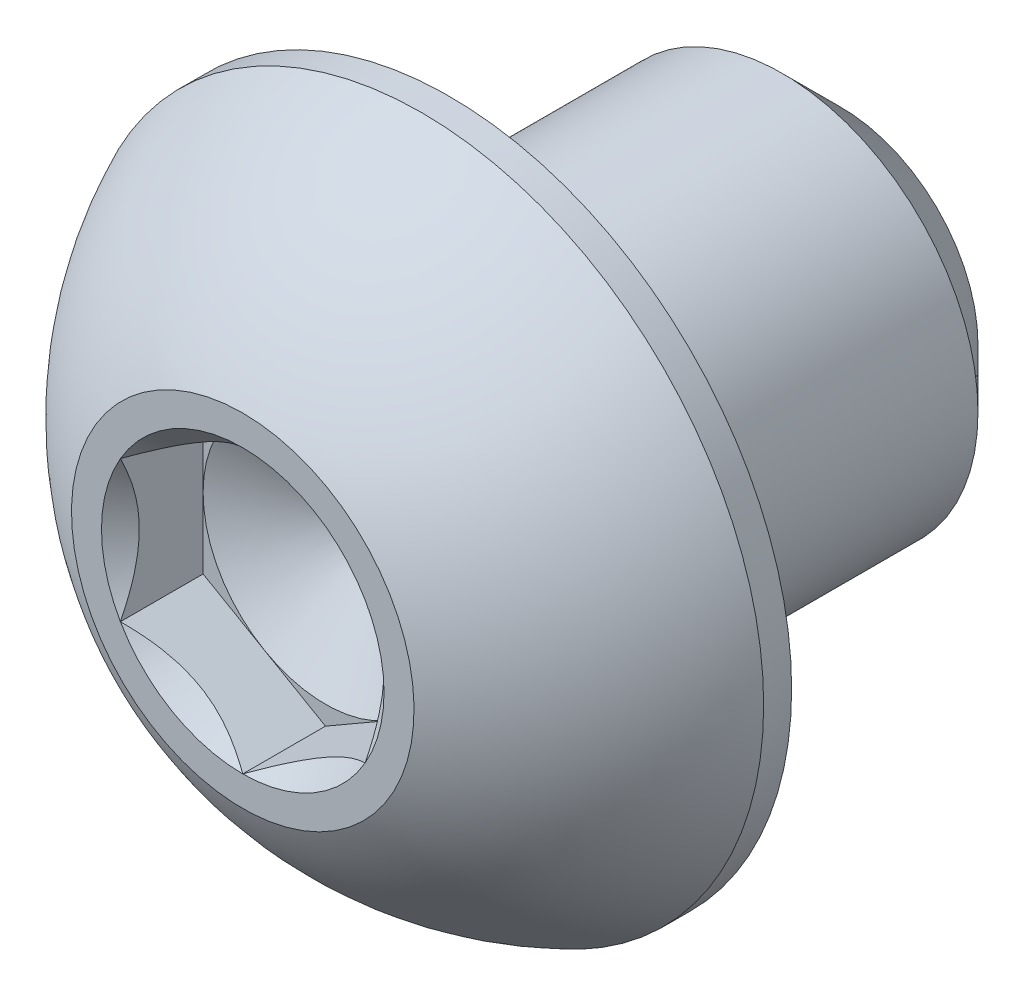
ISO-10303-21;
HEADER;
FILE_DESCRIPTION(('STEP AP214'),'2;1');
FILE_NAME('part.step','',(''),(''),'','','');
FILE_SCHEMA(('AUTOMOTIVE_DESIGN { 1 0 10303 214 1 1 1 1 }'));
ENDSEC;
DATA;
#1=APPLICATION_CONTEXT('core data for automotive mechanical design processes');
#2=APPLICATION_PROTOCOL_DEFINITION('international standard','automotive_design',2000,#1);
#3=PRODUCT_CONTEXT('',#1,'mechanical');
#4=PRODUCT('Part','Part','',(#3));
#5=PRODUCT_RELATED_PRODUCT_CATEGORY('part','',(#4));
#6=PRODUCT_DEFINITION_FORMATION('','',#4);
#7=PRODUCT_DEFINITION_CONTEXT('part definition',#1,'design');
#8=PRODUCT_DEFINITION('design','',#6,#7);
#9=PRODUCT_DEFINITION_SHAPE('','',#8);
#10=(LENGTH_UNIT() NAMED_UNIT(*) SI_UNIT(.MILLI.,.METRE.));
#11=(NAMED_UNIT(*) PLANE_ANGLE_UNIT() SI_UNIT($,.RADIAN.));
#12=(NAMED_UNIT(*) SI_UNIT($,.STERADIAN.) SOLID_ANGLE_UNIT());
#13=UNCERTAINTY_MEASURE_WITH_UNIT(LENGTH_MEASURE(1.E-05),#10,'distance_accuracy_value','');
#14=(GEOMETRIC_REPRESENTATION_CONTEXT(3) GLOBAL_UNCERTAINTY_ASSIGNED_CONTEXT((#13)) GLOBAL_UNIT_ASSIGNED_CONTEXT((#10,
#11,#12)) REPRESENTATION_CONTEXT('',''));
#15=CARTESIAN_POINT('',(0.,0.,0.));
#16=DIRECTION('',(0.,0.,1.));
#17=DIRECTION('',(1.,0.,0.));
#18=AXIS2_PLACEMENT_3D('',#15,#16,#17);
#19=CARTESIAN_POINT('',(0.,1.984375,4.8514));
#20=DIRECTION('',(0.,0.,-1.));
#21=DIRECTION('',(-1.,0.,0.));
#22=AXIS2_PLACEMENT_3D('',#19,#20,#21);
#23=PLANE('',#22);
#24=CARTESIAN_POINT('',(0.,0.,4.8514));
#25=DIRECTION('',(0.,0.,1.));
#26=DIRECTION('',(1.,0.,0.));
#27=AXIS2_PLACEMENT_3D('',#24,#25,#26);
#28=CIRCLE('',#27,2.778125);
#29=CARTESIAN_POINT('',(0.,2.778125,4.8514));
#30=VERTEX_POINT('',#29);
#31=EDGE_CURVE('E187',#30,#30,#28,.T.);
#32=ORIENTED_EDGE('',*,*,#31,.T.);
#33=EDGE_LOOP('',(#32));
#34=FACE_BOUND('',#33,.T.);
#35=CARTESIAN_POINT('',(0.,0.,4.8514));
#36=DIRECTION('',(0.,0.,1.));
#37=DIRECTION('',(1.,0.,0.));
#38=AXIS2_PLACEMENT_3D('',#35,#36,#37);
#39=CIRCLE('',#38,2.29135888084633);
#40=CARTESIAN_POINT('',(0.,2.29135888084633,4.8514));
#41=VERTEX_POINT('',#40);
#42=CARTESIAN_POINT('',(-1.984375,1.14567944042316,4.8514));
#43=VERTEX_POINT('',#42);
#44=EDGE_CURVE('E129',#41,#43,#39,.T.);
#45=ORIENTED_EDGE('',*,*,#44,.F.);
#46=CARTESIAN_POINT('',(0.,0.,4.8514));
#47=DIRECTION('',(0.,0.,1.));
#48=DIRECTION('',(1.,0.,0.));
#49=AXIS2_PLACEMENT_3D('',#46,#47,#48);
#50=CIRCLE('',#49,2.29135888084633);
#51=CARTESIAN_POINT('',(1.984375,1.14567944042316,4.8514));
#52=VERTEX_POINT('',#51);
#53=EDGE_CURVE('E113',#52,#41,#50,.T.);
#54=ORIENTED_EDGE('',*,*,#53,.F.);
#55=CARTESIAN_POINT('',(0.,0.,4.8514));
#56=DIRECTION('',(0.,0.,1.));
#57=DIRECTION('',(1.,0.,0.));
#58=AXIS2_PLACEMENT_3D('',#55,#56,#57);
#59=CIRCLE('',#58,2.29135888084633);
#60=CARTESIAN_POINT('',(1.984375,-1.14567944042316,4.8514));
#61=VERTEX_POINT('',#60);
#62=EDGE_CURVE('E125',#61,#52,#59,.T.);
#63=ORIENTED_EDGE('',*,*,#62,.F.);
#64=CARTESIAN_POINT('',(0.,0.,4.8514));
#65=DIRECTION('',(0.,0.,1.));
#66=DIRECTION('',(1.,0.,0.));
#67=AXIS2_PLACEMENT_3D('',#64,#65,#66);
#68=CIRCLE('',#67,2.29135888084633);
#69=CARTESIAN_POINT('',(0.,-2.29135888084633,4.8514));
#70=VERTEX_POINT('',#69);
#71=EDGE_CURVE('E149',#70,#61,#68,.T.);
#72=ORIENTED_EDGE('',*,*,#71,.F.);
#73=CARTESIAN_POINT('',(0.,0.,4.8514));
#74=DIRECTION('',(0.,0.,1.));
#75=DIRECTION('',(1.,0.,0.));
#76=AXIS2_PLACEMENT_3D('',#73,#74,#75);
#77=CIRCLE('',#76,2.29135888084633);
#78=CARTESIAN_POINT('',(-1.984375,-1.14567944042317,4.8514));
#79=VERTEX_POINT('',#78);
#80=EDGE_CURVE('E463',#79,#70,#77,.T.);
#81=ORIENTED_EDGE('',*,*,#80,.F.);
#82=CARTESIAN_POINT('',(0.,0.,4.8514));
#83=DIRECTION('',(0.,0.,1.));
#84=DIRECTION('',(1.,0.,0.));
#85=AXIS2_PLACEMENT_3D('',#82,#83,#84);
#86=CIRCLE('',#85,2.29135888084633);
#87=EDGE_CURVE('E474',#43,#79,#86,.T.);
#88=ORIENTED_EDGE('',*,*,#87,.F.);
#89=EDGE_LOOP('',(#45,#54,#63,#72,#81,#88));
#90=FACE_BOUND('',#89,.T.);
#91=ADVANCED_FACE('F39',(#34,#90),#23,.F.);
#92=CARTESIAN_POINT('',(0.,0.,-4.8514));
#93=DIRECTION('',(0.,0.,1.));
#94=DIRECTION('',(1.,0.,0.));
#95=AXIS2_PLACEMENT_3D('',#92,#93,#94);
#96=CONICAL_SURFACE('',#95,2.2225,0.785398163397446);
#97=CARTESIAN_POINT('',(0.,0.,-3.8989));
#98=DIRECTION('',(0.,0.,1.));
#99=DIRECTION('',(1.,0.,0.));
#100=AXIS2_PLACEMENT_3D('',#97,#98,#99);
#101=CIRCLE('',#100,3.175);
#102=CARTESIAN_POINT('',(3.175,0.,-3.8989));
#103=VERTEX_POINT('',#102);
#104=EDGE_CURVE('E11',#103,#103,#101,.T.);
#105=ORIENTED_EDGE('',*,*,#104,.F.);
#106=EDGE_LOOP('',(#105));
#107=FACE_BOUND('',#106,.T.);
#108=CARTESIAN_POINT('',(0.,0.,-4.8514));
#109=DIRECTION('',(0.,0.,1.));
#110=DIRECTION('',(1.,0.,0.));
#111=AXIS2_PLACEMENT_3D('',#108,#109,#110);
#112=CIRCLE('',#111,2.2225);
#113=CARTESIAN_POINT('',(2.2225,0.,-4.8514));
#114=VERTEX_POINT('',#113);
#115=EDGE_CURVE('E178',#114,#114,#112,.T.);
#116=ORIENTED_EDGE('',*,*,#115,.T.);
#117=EDGE_LOOP('',(#116));
#118=FACE_BOUND('',#117,.T.);
#119=ADVANCED_FACE('F41',(#107,#118),#96,.T.);
#120=CARTESIAN_POINT('',(0.,0.,4.8514));
#121=DIRECTION('',(0.,0.,1.));
#122=DIRECTION('',(1.,0.,0.));
#123=AXIS2_PLACEMENT_3D('',#120,#121,#122);
#124=CYLINDRICAL_SURFACE('',#123,3.175);
#125=CARTESIAN_POINT('',(0.,0.,1.4986));
#126=DIRECTION('',(0.,0.,1.));
#127=DIRECTION('',(1.,0.,0.));
#128=AXIS2_PLACEMENT_3D('',#125,#126,#127);
#129=CIRCLE('',#128,3.175);
#130=CARTESIAN_POINT('',(3.175,0.,1.4986));
#131=VERTEX_POINT('',#130);
#132=EDGE_CURVE('E48',#131,#131,#129,.T.);
#133=ORIENTED_EDGE('',*,*,#132,.F.);
#134=EDGE_LOOP('',(#133));
#135=FACE_BOUND('',#134,.T.);
#136=ORIENTED_EDGE('',*,*,#104,.T.);
#137=EDGE_LOOP('',(#136));
#138=FACE_BOUND('',#137,.T.);
#139=ADVANCED_FACE('F205',(#135,#138),#124,.T.);
#140=CARTESIAN_POINT('',(0.,5.5499,1.4986));
#141=DIRECTION('',(0.,0.,1.));
#142=DIRECTION('',(1.,0.,0.));
#143=AXIS2_PLACEMENT_3D('',#140,#141,#142);
#144=PLANE('',#143);
#145=CARTESIAN_POINT('',(0.,0.,1.4986));
#146=DIRECTION('',(0.,0.,1.));
#147=DIRECTION('',(1.,0.,0.));
#148=AXIS2_PLACEMENT_3D('',#145,#146,#147);
#149=CIRCLE('',#148,5.5499);
#150=CARTESIAN_POINT('',(5.5499,0.,1.4986));
#151=VERTEX_POINT('',#150);
#152=EDGE_CURVE('E196',#151,#151,#149,.T.);
#153=ORIENTED_EDGE('',*,*,#152,.F.);
#154=EDGE_LOOP('',(#153));
#155=FACE_BOUND('',#154,.T.);
#156=ORIENTED_EDGE('',*,*,#132,.T.);
#157=EDGE_LOOP('',(#156));
#158=FACE_BOUND('',#157,.T.);
#159=ADVANCED_FACE('F203',(#155,#158),#144,.F.);
#160=CARTESIAN_POINT('',(0.,0.,4.8514));
#161=DIRECTION('',(0.,0.,1.));
#162=DIRECTION('',(1.,0.,0.));
#163=AXIS2_PLACEMENT_3D('',#160,#161,#162);
#164=CYLINDRICAL_SURFACE('',#163,5.5499);
#165=CARTESIAN_POINT('',(0.,0.,1.95217142857143));
#166=DIRECTION('',(0.,0.,1.));
#167=DIRECTION('',(1.,0.,0.));
#168=AXIS2_PLACEMENT_3D('',#165,#166,#167);
#169=CIRCLE('',#168,5.5499);
#170=CARTESIAN_POINT('',(0.,5.5499,1.95217142857143));
#171=VERTEX_POINT('',#170);
#172=EDGE_CURVE('E192',#171,#171,#169,.T.);
#173=ORIENTED_EDGE('',*,*,#172,.F.);
#174=EDGE_LOOP('',(#173));
#175=FACE_BOUND('',#174,.T.);
#176=ORIENTED_EDGE('',*,*,#152,.T.);
#177=EDGE_LOOP('',(#176));
#178=FACE_BOUND('',#177,.T.);
#179=ADVANCED_FACE('F224',(#175,#178),#164,.T.);
#180=CARTESIAN_POINT('',(0.,0.,-0.579171793145449));
#181=DIRECTION('',(0.,0.,1.));
#182=DIRECTION('',(0.,1.,0.));
#183=AXIS2_PLACEMENT_3D('',#180,#181,#182);
#184=SPHERICAL_SURFACE('',#183,6.09992528775);
#185=CARTESIAN_POINT('',(0.,2.778125,4.8514));
#186=CARTESIAN_POINT('',(0.,2.81602671338564,4.83201064772217));
#187=CARTESIAN_POINT('',(0.,2.85372537445918,4.81222438218914));
#188=CARTESIAN_POINT('',(0.,2.92870021164798,4.7718669699155));
#189=CARTESIAN_POINT('',(0.,2.96597638776324,4.75129582317489));
#190=CARTESIAN_POINT('',(0.,3.04008987470139,4.7093775937889));
#191=CARTESIAN_POINT('',(0.,3.07692718552427,4.68803051114351));
#192=CARTESIAN_POINT('',(0.,3.15014680356086,4.64456978760222));
#193=CARTESIAN_POINT('',(0.,3.18652911077458,4.62245614670631));
#194=CARTESIAN_POINT('',(0.,3.25882276944387,4.57747199565968));
#195=CARTESIAN_POINT('',(0.,3.29473412089944,4.55460148550897));
#196=CARTESIAN_POINT('',(0.,3.36607012592493,4.50811362336544));
#197=CARTESIAN_POINT('',(0.,3.40149477949484,4.48449627137263));
#198=CARTESIAN_POINT('',(0.,3.47184185902622,4.43652507858578));
#199=CARTESIAN_POINT('',(0.,3.50676428498768,4.41217123779175));
#200=CARTESIAN_POINT('',(0.,3.57609160000261,4.36273774378183));
#201=CARTESIAN_POINT('',(0.,3.61049648905608,4.33765809056595));
#202=CARTESIAN_POINT('',(0.,3.67877364776563,4.28678396614726));
#203=CARTESIAN_POINT('',(0.,3.71264591742172,4.26098949494445));
#204=CARTESIAN_POINT('',(0.,3.77984298835613,4.20869704238412));
#205=CARTESIAN_POINT('',(0.,3.81316778963445,4.18219906102659));
#206=CARTESIAN_POINT('',(0.,3.87925531482814,4.12851120438586));
#207=CARTESIAN_POINT('',(0.,3.91201803874352,4.10132132910267));
#208=CARTESIAN_POINT('',(0.,3.97696704663191,4.04626160415579));
#209=CARTESIAN_POINT('',(0.,4.00915333060493,4.01839175449209));
#210=CARTESIAN_POINT('',(0.,4.07293534872958,3.96198429841707));
#211=CARTESIAN_POINT('',(0.,4.10453108288122,3.93344669200573));
#212=CARTESIAN_POINT('',(0.,4.16711815037044,3.87571623280082));
#213=CARTESIAN_POINT('',(0.,4.19810948370803,3.84652338000723));
#214=CARTESIAN_POINT('',(0.,4.25947416353471,3.78749522565121));
#215=CARTESIAN_POINT('',(0.,4.28984751002382,3.75765992408877));
#216=CARTESIAN_POINT('',(0.,4.34996290103328,3.69735995144623));
#217=CARTESIAN_POINT('',(0.,4.37970494555363,3.66689528036614));
#218=CARTESIAN_POINT('',(0.,4.43854469425657,3.60534992384361));
#219=CARTESIAN_POINT('',(0.,4.46764239843916,3.57426923840117));
#220=CARTESIAN_POINT('',(0.,4.52518071056457,3.51150547835869));
#221=CARTESIAN_POINT('',(0.,4.55362131850739,3.47982240375866));
#222=CARTESIAN_POINT('',(0.,4.60983297031029,3.41586775468214));
#223=CARTESIAN_POINT('',(0.,4.63760401417035,3.38359618020565));
#224=CARTESIAN_POINT('',(0.,4.6924643634894,3.31847867864499));
#225=CARTESIAN_POINT('',(0.,4.71955366894838,3.28563275156081));
#226=CARTESIAN_POINT('',(0.,4.77303866600855,3.21938094383918));
#227=CARTESIAN_POINT('',(0.,4.79943435760973,3.18597506320173));
#228=CARTESIAN_POINT('',(0.,4.85152055556542,3.11861799290146));
#229=CARTESIAN_POINT('',(0.,4.87721106191991,3.08466680323865));
#230=CARTESIAN_POINT('',(0.,4.927875627133,3.01623399846878));
#231=CARTESIAN_POINT('',(0.,4.95284968599158,2.98175238336172));
#232=CARTESIAN_POINT('',(0.,5.00207040804361,2.91227384381449));
#233=CARTESIAN_POINT('',(0.,5.02631707123706,2.87727691937433));
#234=CARTESIAN_POINT('',(0.,5.0740723726572,2.80678310316972));
#235=CARTESIAN_POINT('',(0.,5.09758101088389,2.77128621140527));
#236=CARTESIAN_POINT('',(0.,5.1438499566405,2.6998080217543));
#237=CARTESIAN_POINT('',(0.,5.16661026417041,2.66382672386778));
#238=CARTESIAN_POINT('',(0.,5.21137257072764,2.59139549546688));
#239=CARTESIAN_POINT('',(0.,5.23337456975495,2.5549455649525));
#240=CARTESIAN_POINT('',(0.,5.276610614416,2.48159305046432));
#241=CARTESIAN_POINT('',(0.,5.29784466004975,2.44469046649051));
#242=CARTESIAN_POINT('',(0.,5.33953548787471,2.37044882181283));
#243=CARTESIAN_POINT('',(0.,5.35999227006592,2.33310976110895));
#244=CARTESIAN_POINT('',(0.,5.40011960846765,2.25801153430598));
#245=CARTESIAN_POINT('',(0.,5.41979016467818,2.22025236820689));
#246=CARTESIAN_POINT('',(0.,5.45833640797136,2.14433047394067));
#247=CARTESIAN_POINT('',(0.,5.47721209505402,2.10616774577356));
#248=CARTESIAN_POINT('',(0.,5.51416039973219,2.02945549304741));
#249=CARTESIAN_POINT('',(0.,5.53223301732771,1.99090596848837));
#250=CARTESIAN_POINT('',(0.,5.5499,1.95217142857143));
#251=B_SPLINE_CURVE_WITH_KNOTS('',3,(#185,#186,#187,#188,#189,#190,#191,#192,#193,#194,#195,
#196,#197,#198,#199,#200,#201,#202,#203,#204,#205,#206,#207,#208,#209,#210,#211,#212,#213,#214,
#215,#216,#217,#218,#219,#220,#221,#222,#223,#224,#225,#226,#227,#228,#229,#230,#231,#232,#233,
#234,#235,#236,#237,#238,#239,#240,#241,#242,#243,#244,#245,#246,#247,#248,#249,#250),
.UNSPECIFIED.,.F.,.F.,(4,2,2,2,2,2,2,2,2,2,2,2,2,2,2,2,2,2,2,2,2,2,2,2,2,2,2,2,2,2,2,2,4),(0.,
0.127717597491554,0.255435194983109,0.383152792474662,0.510870389966216,0.63858798745777,
0.766305584949325,0.894023182440878,1.02174077993243,1.14945837742399,1.27717597491554,
1.4048935724071,1.53261116989865,1.6603287673902,1.78804636488176,1.91576396237331,
2.04348155986487,2.17119915735642,2.29891675484797,2.42663435233953,2.55435194983108,
2.68206954732263,2.80978714481419,2.93750474230574,3.0652223397973,3.19293993728885,
3.3206575347804,3.44837513227196,3.57609272976351,3.70381032725507,3.83152792474662,
3.95924552223817,4.08696311972973),.UNSPECIFIED.);
#252=EDGE_CURVE('BSEAM216',#30,#171,#251,.T.);
#253=ORIENTED_EDGE('',*,*,#31,.F.);
#254=ORIENTED_EDGE('',*,*,#172,.T.);
#255=ORIENTED_EDGE('',*,*,#252,.T.);
#256=ORIENTED_EDGE('',*,*,#252,.F.);
#257=EDGE_LOOP('',(#253,#255,#254,#256));
#258=FACE_BOUND('',#257,.T.);
#259=ADVANCED_FACE('F216',(#258),#184,.T.);
#260=CARTESIAN_POINT('',(0.,2.2225,-4.8514));
#261=DIRECTION('',(0.,0.,1.));
#262=DIRECTION('',(1.,0.,0.));
#263=AXIS2_PLACEMENT_3D('',#260,#261,#262);
#264=PLANE('',#263);
#265=ORIENTED_EDGE('',*,*,#115,.F.);
#266=EDGE_LOOP('',(#265));
#267=FACE_BOUND('',#266,.T.);
#268=ADVANCED_FACE('F214',(#267),#264,.F.);
#269=CARTESIAN_POINT('',(1.984375,1.14567944042316,4.8514));
#270=DIRECTION('',(-0.499999999999999,-0.866025403784439,0.));
#271=DIRECTION('',(0.866025403784439,-0.499999999999999,0.));
#272=AXIS2_PLACEMENT_3D('',#269,#270,#271);
#273=PLANE('',#272);
#274=CARTESIAN_POINT('',(1.984575,1.14556397036933,4.85151547878184));
#275=CARTESIAN_POINT('',(1.9163590048332,1.18494849354192,4.81216285226392));
#276=CARTESIAN_POINT('',(1.84700231489304,1.22499159714897,4.77512131044619));
#277=CARTESIAN_POINT('',(1.70557619954781,1.30664400291398,4.70729885842333));
#278=CARTESIAN_POINT('',(1.63349332126322,1.34826107209555,4.67655568909175));
#279=CARTESIAN_POINT('',(1.488141602734,1.43217992591557,4.62389188881121));
#280=CARTESIAN_POINT('',(1.41490978751306,1.47446033414663,4.60183887587997));
#281=CARTESIAN_POINT('',(1.26683381740529,1.55995203534886,4.56786149294388));
#282=CARTESIAN_POINT('',(1.19199418724657,1.60316071596705,4.55591175609173));
#283=CARTESIAN_POINT('',(1.06301458545618,1.6776271237807,4.54513009908191));
#284=CARTESIAN_POINT('',(1.00904128422756,1.7087886237741,4.54353389905907));
#285=CARTESIAN_POINT('',(0.901182881480199,1.77106070163465,4.54622183886529));
#286=CARTESIAN_POINT('',(0.847297817514476,1.80217125782056,4.55050804034046));
#287=CARTESIAN_POINT('',(0.740036461751395,1.86409863044402,4.56471687301352));
#288=CARTESIAN_POINT('',(0.686660807239859,1.89491507894443,4.57464581045227));
#289=CARTESIAN_POINT('',(0.580832482591102,1.95601509066828,4.59959508427454));
#290=CARTESIAN_POINT('',(0.528379742028897,1.9862986945516,4.61461503038949));
#291=CARTESIAN_POINT('',(0.39401766103635,2.06387267818152,4.65920785163567));
#292=CARTESIAN_POINT('',(0.312941642841675,2.11068193911104,4.69214299593833));
#293=CARTESIAN_POINT('',(0.19372669327016,2.17951072233758,4.7477424412022));
#294=CARTESIAN_POINT('',(0.154440075613998,2.20219286161692,4.76727759205186));
#295=CARTESIAN_POINT('',(0.0765946381319463,2.24713694590237,4.8081287381194));
#296=CARTESIAN_POINT('',(0.0380353888983005,2.26939913882716,4.82944363956835));
#297=CARTESIAN_POINT('',(-0.000200000000000666,2.29147435090016,4.85151547878184));
#298=B_SPLINE_CURVE_WITH_KNOTS('',3,(#274,#275,#276,#277,#278,#279,#280,#281,#282,#283,#284,
#285,#286,#287,#288,#289,#290,#291,#292,#293,#294,#295,#296,#297),.UNSPECIFIED.,.F.,.F.,(4,2,2,
2,2,2,2,2,2,2,2,4),(0.,0.264339630306627,0.530219665093695,0.791876416371462,1.05287424418109,
1.239639843932,1.42647091743852,1.61351120244035,1.8005371524754,2.09764209964316,
2.24579179873714,2.39385111134157),.UNSPECIFIED.);
#299=EDGE_CURVE('E110',#52,#41,#298,.T.);
#300=ORIENTED_EDGE('',*,*,#299,.T.);
#301=DIRECTION('',(0.,0.,-1.));
#302=VECTOR('',#301,1.);
#303=CARTESIAN_POINT('',(0.,2.29135888084633,4.8514));
#304=LINE('',#303,#302);
#305=CARTESIAN_POINT('',(0.,2.29135888084633,3.51028));
#306=VERTEX_POINT('',#305);
#307=EDGE_CURVE('E175',#41,#306,#304,.T.);
#308=ORIENTED_EDGE('',*,*,#307,.T.);
#309=DIRECTION('',(-0.866025403784439,0.499999999999999,0.));
#310=VECTOR('',#309,1.);
#311=CARTESIAN_POINT('',(1.984375,1.14567944042316,3.51028));
#312=LINE('',#311,#310);
#313=CARTESIAN_POINT('',(0.992187499999998,1.71851916063475,3.51028));
#314=VERTEX_POINT('',#313);
#315=EDGE_CURVE('E505',#314,#306,#312,.T.);
#316=ORIENTED_EDGE('',*,*,#315,.F.);
#317=CARTESIAN_POINT('',(1.984375,1.14567944042316,3.51028));
#318=VERTEX_POINT('',#317);
#319=EDGE_CURVE('E55',#318,#314,#312,.T.);
#320=ORIENTED_EDGE('',*,*,#319,.F.);
#321=DIRECTION('',(0.,0.,-1.));
#322=VECTOR('',#321,1.);
#323=CARTESIAN_POINT('',(1.984375,1.14567944042316,4.8514));
#324=LINE('',#323,#322);
#325=EDGE_CURVE('E144',#52,#318,#324,.T.);
#326=ORIENTED_EDGE('',*,*,#325,.F.);
#327=EDGE_LOOP('',(#300,#308,#316,#320,#326));
#328=FACE_BOUND('',#327,.T.);
#329=ADVANCED_FACE('F151',(#328),#273,.T.);
#330=CARTESIAN_POINT('',(0.,2.29135888084633,4.8514));
#331=DIRECTION('',(0.5,-0.866025403784438,0.));
#332=DIRECTION('',(0.866025403784438,0.5,0.));
#333=AXIS2_PLACEMENT_3D('',#330,#331,#332);
#334=PLANE('',#333);
#335=CARTESIAN_POINT('',(0.000199999999999143,2.29147435090016,4.85151547878184));
#336=CARTESIAN_POINT('',(-0.068015995166803,2.25208982772757,4.81216285226392));
#337=CARTESIAN_POINT('',(-0.137372685106967,2.21204672412052,4.77512131044618));
#338=CARTESIAN_POINT('',(-0.278798800452188,2.13039431835551,4.70729885842332));
#339=CARTESIAN_POINT('',(-0.350881678736783,2.08877724917394,4.67655568909175));
#340=CARTESIAN_POINT('',(-0.496233397266005,2.00485839535392,4.62389188881121));
#341=CARTESIAN_POINT('',(-0.569465212486939,1.96257798712287,4.60183887587996));
#342=CARTESIAN_POINT('',(-0.717541182594707,1.87708628592063,4.56786149294388));
#343=CARTESIAN_POINT('',(-0.792380812753425,1.83387760530244,4.55591175609173));
#344=CARTESIAN_POINT('',(-0.921360414543816,1.75941119748879,4.54513009908191));
#345=CARTESIAN_POINT('',(-0.975333715772443,1.72824969749539,4.54353389905907));
#346=CARTESIAN_POINT('',(-1.0831921185198,1.66597761963484,4.54622183886529));
#347=CARTESIAN_POINT('',(-1.13707718248552,1.63486706344893,4.55050804034046));
#348=CARTESIAN_POINT('',(-1.2443385382486,1.57293969082547,4.56471687301352));
#349=CARTESIAN_POINT('',(-1.29771419276014,1.54212324232506,4.57464581045227));
#350=CARTESIAN_POINT('',(-1.4035425174089,1.48102323060122,4.59959508427454));
#351=CARTESIAN_POINT('',(-1.4559952579711,1.45073962671789,4.61461503038949));
#352=CARTESIAN_POINT('',(-1.59035733896365,1.37316564308797,4.65920785163567));
#353=CARTESIAN_POINT('',(-1.67143335715833,1.32635638215845,4.69214299593833));
#354=CARTESIAN_POINT('',(-1.79064830672984,1.25752759893191,4.7477424412022));
#355=CARTESIAN_POINT('',(-1.829934924386,1.23484545965257,4.76727759205186));
#356=CARTESIAN_POINT('',(-1.90778036186805,1.18990137536712,4.8081287381194));
#357=CARTESIAN_POINT('',(-1.9463396111017,1.16763918244233,4.82944363956835));
#358=CARTESIAN_POINT('',(-1.984575,1.14556397036932,4.85151547878184));
#359=B_SPLINE_CURVE_WITH_KNOTS('',3,(#335,#336,#337,#338,#339,#340,#341,#342,#343,#344,#345,
#346,#347,#348,#349,#350,#351,#352,#353,#354,#355,#356,#357,#358),.UNSPECIFIED.,.F.,.F.,(4,2,2,
2,2,2,2,2,2,2,2,4),(0.,0.264339630306626,0.530219665093694,0.79187641637146,1.05287424418109,
1.239639843932,1.42647091743852,1.61351120244035,1.8005371524754,2.09764209964316,
2.24579179873714,2.39385111134157),.UNSPECIFIED.);
#360=EDGE_CURVE('E490',#41,#43,#359,.T.);
#361=ORIENTED_EDGE('',*,*,#360,.T.);
#362=DIRECTION('',(0.,0.,-1.));
#363=VECTOR('',#362,1.);
#364=CARTESIAN_POINT('',(-1.984375,1.14567944042316,4.8514));
#365=LINE('',#364,#363);
#366=CARTESIAN_POINT('',(-1.984375,1.14567944042316,3.51028));
#367=VERTEX_POINT('',#366);
#368=EDGE_CURVE('E171',#43,#367,#365,.T.);
#369=ORIENTED_EDGE('',*,*,#368,.T.);
#370=DIRECTION('',(-0.866025403784438,-0.5,0.));
#371=VECTOR('',#370,1.);
#372=CARTESIAN_POINT('',(0.,2.29135888084633,3.51028));
#373=LINE('',#372,#371);
#374=CARTESIAN_POINT('',(-0.9921875,1.71851916063474,3.51028));
#375=VERTEX_POINT('',#374);
#376=EDGE_CURVE('E508',#375,#367,#373,.T.);
#377=ORIENTED_EDGE('',*,*,#376,.F.);
#378=EDGE_CURVE('E509',#306,#375,#373,.T.);
#379=ORIENTED_EDGE('',*,*,#378,.F.);
#380=ORIENTED_EDGE('',*,*,#307,.F.);
#381=EDGE_LOOP('',(#361,#369,#377,#379,#380));
#382=FACE_BOUND('',#381,.T.);
#383=ADVANCED_FACE('F222',(#382),#334,.T.);
#384=CARTESIAN_POINT('',(-1.984375,1.14567944042316,4.8514));
#385=DIRECTION('',(1.,0.,0.));
#386=DIRECTION('',(0.,0.,-1.));
#387=AXIS2_PLACEMENT_3D('',#384,#385,#386);
#388=PLANE('',#387);
#389=CARTESIAN_POINT('',(-1.984375,-2.24664989492636,5.55757008331692));
#390=CARTESIAN_POINT('',(-1.984375,-2.19177035879913,5.51644669928858));
#391=CARTESIAN_POINT('',(-1.984375,-2.1365793309425,5.4757329661326));
#392=CARTESIAN_POINT('',(-1.984375,-2.0254530694156,5.39530486706176));
#393=CARTESIAN_POINT('',(-1.984375,-1.96951764844329,5.3555907602265));
#394=CARTESIAN_POINT('',(-1.984375,-1.85637247000972,5.27705999604987));
#395=CARTESIAN_POINT('',(-1.984375,-1.79915619451492,5.23825268502025));
#396=CARTESIAN_POINT('',(-1.984375,-1.68374612486123,5.16213116655778));
#397=CARTESIAN_POINT('',(-1.984375,-1.62555240093273,5.12481685249807));
#398=CARTESIAN_POINT('',(-1.984375,-1.44283684202776,5.01156794235898));
#399=CARTESIAN_POINT('',(-1.984375,-1.31636516124235,4.93872141910062));
#400=CARTESIAN_POINT('',(-1.984375,-1.05716498260296,4.80571175577765));
#401=CARTESIAN_POINT('',(-1.984375,-0.924459462264122,4.74550591965465));
#402=CARTESIAN_POINT('',(-1.984375,-0.724893074141588,4.67186183961541));
#403=CARTESIAN_POINT('',(-1.984375,-0.660907572248813,4.65066291748558));
#404=CARTESIAN_POINT('',(-1.984375,-0.531425551080247,4.61340711479737));
#405=CARTESIAN_POINT('',(-1.984375,-0.465928924835295,4.59735059946328));
#406=CARTESIAN_POINT('',(-1.984375,-0.334891945890405,4.57147084345925));
#407=CARTESIAN_POINT('',(-1.984375,-0.269372555502921,4.56154310154836));
#408=CARTESIAN_POINT('',(-1.984375,-0.137675185771461,4.54810859031056));
#409=CARTESIAN_POINT('',(-1.984375,-0.071497313578063,4.54460079294677));
#410=CARTESIAN_POINT('',(-1.984375,0.0586431546448481,4.54425164823735));
#411=CARTESIAN_POINT('',(-1.984375,0.122605247687119,4.54718962459112));
#412=CARTESIAN_POINT('',(-1.984375,0.249962419599664,4.55909170918258));
#413=CARTESIAN_POINT('',(-1.984375,0.313357441624571,4.56805641485244));
#414=CARTESIAN_POINT('',(-1.984375,0.440194078343455,4.59168115034761));
#415=CARTESIAN_POINT('',(-1.984375,0.503617615772964,4.60643679973639));
#416=CARTESIAN_POINT('',(-1.984375,0.629083701047629,4.6408707574727));
#417=CARTESIAN_POINT('',(-1.984375,0.691126376772748,4.66054860789798));
#418=CARTESIAN_POINT('',(-1.984375,0.888252191671363,4.73042518633261));
#419=CARTESIAN_POINT('',(-1.984375,1.02048040542615,4.78865558934036));
#420=CARTESIAN_POINT('',(-1.984375,1.27871806100267,4.91806918027673));
#421=CARTESIAN_POINT('',(-1.984375,1.40470281207756,4.98929927195745));
#422=CARTESIAN_POINT('',(-1.984375,1.5867785992022,5.10041293194116));
#423=CARTESIAN_POINT('',(-1.984375,1.64484387516129,5.13712382489262));
#424=CARTESIAN_POINT('',(-1.984375,1.75997827817988,5.21208744763746));
#425=CARTESIAN_POINT('',(-1.984375,1.81704732901584,5.25034029467485));
#426=CARTESIAN_POINT('',(-1.984375,1.92985499213404,5.32778678199377));
#427=CARTESIAN_POINT('',(-1.984375,1.98560066211377,5.36697019322868));
#428=CARTESIAN_POINT('',(-1.984375,2.09633159947627,5.44636660992609));
#429=CARTESIAN_POINT('',(-1.984375,2.15131707145809,5.4865793297131));
#430=CARTESIAN_POINT('',(-1.984375,2.20598450458982,5.52721347260997));
#431=B_SPLINE_CURVE_WITH_KNOTS('',3,(#389,#390,#391,#392,#393,#394,#395,#396,#397,#398,#399,
#400,#401,#402,#403,#404,#405,#406,#407,#408,#409,#410,#411,#412,#413,#414,#415,#416,#417,#418,
#419,#420,#421,#422,#423,#424,#425,#426,#427,#428,#429,#430),.UNSPECIFIED.,.F.,.F.,(4,2,2,2,2,2,
2,2,2,2,2,2,2,2,2,2,2,2,2,2,4),(0.,0.205736210356766,0.411525204809809,0.618909845914796,
0.826279649489809,1.26374370453551,1.69970549535382,1.90175047418286,2.10380979948048,
2.3023211047986,2.50080061937433,2.69259135253523,2.88440110079442,3.07952109080018,
3.27462293514803,3.70679897011889,4.14056631296021,4.34663769336143,4.55272477227101,
4.7571295110882,4.96147812147718),.UNSPECIFIED.);
#432=EDGE_CURVE('E482',#43,#79,#431,.F.);
#433=ORIENTED_EDGE('',*,*,#432,.T.);
#434=DIRECTION('',(0.,0.,-1.));
#435=VECTOR('',#434,1.);
#436=CARTESIAN_POINT('',(-1.984375,-1.14567944042316,4.8514));
#437=LINE('',#436,#435);
#438=CARTESIAN_POINT('',(-1.984375,-1.14567944042316,3.51028));
#439=VERTEX_POINT('',#438);
#440=EDGE_CURVE('E167',#79,#439,#437,.T.);
#441=ORIENTED_EDGE('',*,*,#440,.T.);
#442=DIRECTION('',(0.,-1.,0.));
#443=VECTOR('',#442,1.);
#444=CARTESIAN_POINT('',(-1.984375,1.14567944042316,3.51028));
#445=LINE('',#444,#443);
#446=CARTESIAN_POINT('',(-1.984375,0.,3.51028));
#447=VERTEX_POINT('',#446);
#448=EDGE_CURVE('E513',#447,#439,#445,.T.);
#449=ORIENTED_EDGE('',*,*,#448,.F.);
#450=EDGE_CURVE('E514',#367,#447,#445,.T.);
#451=ORIENTED_EDGE('',*,*,#450,.F.);
#452=ORIENTED_EDGE('',*,*,#368,.F.);
#453=EDGE_LOOP('',(#433,#441,#449,#451,#452));
#454=FACE_BOUND('',#453,.T.);
#455=ADVANCED_FACE('F343',(#454),#388,.T.);
#456=CARTESIAN_POINT('',(-1.984375,-1.14567944042316,4.8514));
#457=DIRECTION('',(0.499999999999999,0.866025403784439,0.));
#458=DIRECTION('',(-0.866025403784439,0.499999999999999,0.));
#459=AXIS2_PLACEMENT_3D('',#456,#457,#458);
#460=PLANE('',#459);
#461=CARTESIAN_POINT('',(-1.984575,-1.14556397036933,4.85151547878184));
#462=CARTESIAN_POINT('',(-1.9163590048332,-1.18494849354192,4.81216285226392));
#463=CARTESIAN_POINT('',(-1.84700231489303,-1.22499159714897,4.77512131044619));
#464=CARTESIAN_POINT('',(-1.70557619954781,-1.30664400291398,4.70729885842332));
#465=CARTESIAN_POINT('',(-1.63349332126322,-1.34826107209555,4.67655568909175));
#466=CARTESIAN_POINT('',(-1.488141602734,-1.43217992591557,4.62389188881121));
#467=CARTESIAN_POINT('',(-1.41490978751306,-1.47446033414663,4.60183887587997));
#468=CARTESIAN_POINT('',(-1.26683381740529,-1.55995203534886,4.56786149294388));
#469=CARTESIAN_POINT('',(-1.19199418724657,-1.60316071596705,4.55591175609173));
#470=CARTESIAN_POINT('',(-1.06301458545618,-1.6776271237807,4.54513009908191));
#471=CARTESIAN_POINT('',(-1.00904128422756,-1.7087886237741,4.54353389905907));
#472=CARTESIAN_POINT('',(-0.901182881480198,-1.77106070163465,4.54622183886529));
#473=CARTESIAN_POINT('',(-0.847297817514475,-1.80217125782056,4.55050804034046));
#474=CARTESIAN_POINT('',(-0.740036461751395,-1.86409863044402,4.56471687301352));
#475=CARTESIAN_POINT('',(-0.686660807239858,-1.89491507894443,4.57464581045227));
#476=CARTESIAN_POINT('',(-0.580832482591102,-1.95601509066828,4.59959508427454));
#477=CARTESIAN_POINT('',(-0.528379742028897,-1.9862986945516,4.61461503038949));
#478=CARTESIAN_POINT('',(-0.39401766103635,-2.06387267818152,4.65920785163567));
#479=CARTESIAN_POINT('',(-0.312941642841674,-2.11068193911104,4.69214299593833));
#480=CARTESIAN_POINT('',(-0.193726693270159,-2.17951072233758,4.7477424412022));
#481=CARTESIAN_POINT('',(-0.154440075613997,-2.20219286161692,4.76727759205186));
#482=CARTESIAN_POINT('',(-0.0765946381319454,-2.24713694590237,4.8081287381194));
#483=CARTESIAN_POINT('',(-0.0380353888982995,-2.26939913882716,4.82944363956835));
#484=CARTESIAN_POINT('',(0.00020000000000208,-2.29147435090017,4.85151547878184));
#485=B_SPLINE_CURVE_WITH_KNOTS('',3,(#461,#462,#463,#464,#465,#466,#467,#468,#469,#470,#471,
#472,#473,#474,#475,#476,#477,#478,#479,#480,#481,#482,#483,#484),.UNSPECIFIED.,.F.,.F.,(4,2,2,
2,2,2,2,2,2,2,2,4),(0.,0.264339630306627,0.530219665093694,0.791876416371461,1.05287424418109,
1.239639843932,1.42647091743852,1.61351120244035,1.8005371524754,2.09764209964316,
2.24579179873714,2.39385111134157),.UNSPECIFIED.);
#486=EDGE_CURVE('E466',#79,#70,#485,.T.);
#487=ORIENTED_EDGE('',*,*,#486,.T.);
#488=DIRECTION('',(0.,0.,-1.));
#489=VECTOR('',#488,1.);
#490=CARTESIAN_POINT('',(0.,-2.29135888084633,4.8514));
#491=LINE('',#490,#489);
#492=CARTESIAN_POINT('',(0.,-2.29135888084633,3.51028));
#493=VERTEX_POINT('',#492);
#494=EDGE_CURVE('E157',#70,#493,#491,.T.);
#495=ORIENTED_EDGE('',*,*,#494,.T.);
#496=DIRECTION('',(0.866025403784439,-0.499999999999999,0.));
#497=VECTOR('',#496,1.);
#498=CARTESIAN_POINT('',(-1.984375,-1.14567944042316,3.51028));
#499=LINE('',#498,#497);
#500=CARTESIAN_POINT('',(-0.992187499999999,-1.71851916063475,3.51028));
#501=VERTEX_POINT('',#500);
#502=EDGE_CURVE('E518',#501,#493,#499,.T.);
#503=ORIENTED_EDGE('',*,*,#502,.F.);
#504=EDGE_CURVE('E519',#439,#501,#499,.T.);
#505=ORIENTED_EDGE('',*,*,#504,.F.);
#506=ORIENTED_EDGE('',*,*,#440,.F.);
#507=EDGE_LOOP('',(#487,#495,#503,#505,#506));
#508=FACE_BOUND('',#507,.T.);
#509=ADVANCED_FACE('F353',(#508),#460,.T.);
#510=CARTESIAN_POINT('',(0.,-2.29135888084633,4.8514));
#511=DIRECTION('',(-0.5,0.866025403784438,0.));
#512=DIRECTION('',(-0.866025403784438,-0.5,0.));
#513=AXIS2_PLACEMENT_3D('',#510,#511,#512);
#514=PLANE('',#513);
#515=CARTESIAN_POINT('',(-0.000199999999997842,-2.29147435090017,4.85151547878184));
#516=CARTESIAN_POINT('',(0.0680159951668045,-2.25208982772757,4.81216285226392));
#517=CARTESIAN_POINT('',(0.137372685106968,-2.21204672412052,4.77512131044619));
#518=CARTESIAN_POINT('',(0.278798800452189,-2.13039431835551,4.70729885842332));
#519=CARTESIAN_POINT('',(0.350881678736784,-2.08877724917394,4.67655568909175));
#520=CARTESIAN_POINT('',(0.496233397266006,-2.00485839535392,4.62389188881122));
#521=CARTESIAN_POINT('',(0.56946521248694,-1.96257798712287,4.60183887587997));
#522=CARTESIAN_POINT('',(0.717541182594708,-1.87708628592063,4.56786149294388));
#523=CARTESIAN_POINT('',(0.792380812753426,-1.83387760530244,4.55591175609173));
#524=CARTESIAN_POINT('',(0.921360414543817,-1.75941119748879,4.54513009908191));
#525=CARTESIAN_POINT('',(0.975333715772444,-1.72824969749539,4.54353389905907));
#526=CARTESIAN_POINT('',(1.0831921185198,-1.66597761963484,4.54622183886529));
#527=CARTESIAN_POINT('',(1.13707718248553,-1.63486706344893,4.55050804034046));
#528=CARTESIAN_POINT('',(1.24433853824861,-1.57293969082547,4.56471687301352));
#529=CARTESIAN_POINT('',(1.29771419276014,-1.54212324232506,4.57464581045227));
#530=CARTESIAN_POINT('',(1.4035425174089,-1.48102323060122,4.59959508427454));
#531=CARTESIAN_POINT('',(1.4559952579711,-1.45073962671789,4.61461503038949));
#532=CARTESIAN_POINT('',(1.59035733896365,-1.37316564308797,4.65920785163567));
#533=CARTESIAN_POINT('',(1.67143335715833,-1.32635638215845,4.69214299593833));
#534=CARTESIAN_POINT('',(1.79064830672984,-1.25752759893191,4.7477424412022));
#535=CARTESIAN_POINT('',(1.829934924386,-1.23484545965257,4.76727759205186));
#536=CARTESIAN_POINT('',(1.90778036186805,-1.18990137536713,4.8081287381194));
#537=CARTESIAN_POINT('',(1.9463396111017,-1.16763918244233,4.82944363956835));
#538=CARTESIAN_POINT('',(1.984575,-1.14556397036933,4.85151547878184));
#539=B_SPLINE_CURVE_WITH_KNOTS('',3,(#515,#516,#517,#518,#519,#520,#521,#522,#523,#524,#525,
#526,#527,#528,#529,#530,#531,#532,#533,#534,#535,#536,#537,#538),.UNSPECIFIED.,.F.,.F.,(4,2,2,
2,2,2,2,2,2,2,2,4),(0.,0.264339630306626,0.530219665093694,0.791876416371459,1.05287424418109,
1.239639843932,1.42647091743852,1.61351120244035,1.8005371524754,2.09764209964316,
2.24579179873714,2.39385111134157),.UNSPECIFIED.);
#540=EDGE_CURVE('E455',#70,#61,#539,.T.);
#541=ORIENTED_EDGE('',*,*,#540,.T.);
#542=DIRECTION('',(0.,0.,-1.));
#543=VECTOR('',#542,1.);
#544=CARTESIAN_POINT('',(1.984375,-1.14567944042316,4.8514));
#545=LINE('',#544,#543);
#546=CARTESIAN_POINT('',(1.984375,-1.14567944042316,3.51028));
#547=VERTEX_POINT('',#546);
#548=EDGE_CURVE('E147',#61,#547,#545,.T.);
#549=ORIENTED_EDGE('',*,*,#548,.T.);
#550=DIRECTION('',(0.866025403784438,0.5,0.));
#551=VECTOR('',#550,1.);
#552=CARTESIAN_POINT('',(0.,-2.29135888084633,3.51028));
#553=LINE('',#552,#551);
#554=CARTESIAN_POINT('',(0.992187500000001,-1.71851916063475,3.51028));
#555=VERTEX_POINT('',#554);
#556=EDGE_CURVE('E522',#555,#547,#553,.T.);
#557=ORIENTED_EDGE('',*,*,#556,.F.);
#558=EDGE_CURVE('E523',#493,#555,#553,.T.);
#559=ORIENTED_EDGE('',*,*,#558,.F.);
#560=ORIENTED_EDGE('',*,*,#494,.F.);
#561=EDGE_LOOP('',(#541,#549,#557,#559,#560));
#562=FACE_BOUND('',#561,.T.);
#563=ADVANCED_FACE('F363',(#562),#514,.T.);
#564=CARTESIAN_POINT('',(1.984375,-1.14567944042316,4.8514));
#565=DIRECTION('',(-1.,0.,0.));
#566=DIRECTION('',(0.,-1.,0.));
#567=AXIS2_PLACEMENT_3D('',#564,#565,#566);
#568=PLANE('',#567);
#569=CARTESIAN_POINT('',(1.984375,-2.24664989492636,5.55757008331692));
#570=CARTESIAN_POINT('',(1.984375,-2.19177035879913,5.51644669928858));
#571=CARTESIAN_POINT('',(1.984375,-2.1365793309425,5.4757329661326));
#572=CARTESIAN_POINT('',(1.984375,-2.0254530694156,5.39530486706176));
#573=CARTESIAN_POINT('',(1.984375,-1.96951764844329,5.35559076022651));
#574=CARTESIAN_POINT('',(1.984375,-1.85637247000972,5.27705999604987));
#575=CARTESIAN_POINT('',(1.984375,-1.79915619451491,5.23825268502025));
#576=CARTESIAN_POINT('',(1.984375,-1.68374612486123,5.16213116655778));
#577=CARTESIAN_POINT('',(1.984375,-1.62555240093272,5.12481685249807));
#578=CARTESIAN_POINT('',(1.984375,-1.44283684202776,5.01156794235898));
#579=CARTESIAN_POINT('',(1.984375,-1.31636516124235,4.93872141910062));
#580=CARTESIAN_POINT('',(1.984375,-1.05716498260296,4.80571175577765));
#581=CARTESIAN_POINT('',(1.984375,-0.924459462264121,4.74550591965465));
#582=CARTESIAN_POINT('',(1.984375,-0.724893074141587,4.67186183961541));
#583=CARTESIAN_POINT('',(1.984375,-0.660907572248812,4.65066291748558));
#584=CARTESIAN_POINT('',(1.984375,-0.531425551080246,4.61340711479737));
#585=CARTESIAN_POINT('',(1.984375,-0.465928924835294,4.59735059946328));
#586=CARTESIAN_POINT('',(1.984375,-0.334891945890405,4.57147084345925));
#587=CARTESIAN_POINT('',(1.984375,-0.269372555502921,4.56154310154837));
#588=CARTESIAN_POINT('',(1.984375,-0.137675185771461,4.54810859031056));
#589=CARTESIAN_POINT('',(1.984375,-0.0714973135780631,4.54460079294677));
#590=CARTESIAN_POINT('',(1.984375,0.0586431546448481,4.54425164823735));
#591=CARTESIAN_POINT('',(1.984375,0.122605247687119,4.54718962459112));
#592=CARTESIAN_POINT('',(1.984375,0.249962419599664,4.55909170918258));
#593=CARTESIAN_POINT('',(1.984375,0.313357441624571,4.56805641485244));
#594=CARTESIAN_POINT('',(1.984375,0.440194078343455,4.59168115034761));
#595=CARTESIAN_POINT('',(1.984375,0.503617615772965,4.60643679973639));
#596=CARTESIAN_POINT('',(1.984375,0.629083701047629,4.6408707574727));
#597=CARTESIAN_POINT('',(1.984375,0.691126376772749,4.66054860789798));
#598=CARTESIAN_POINT('',(1.984375,0.888252191671364,4.73042518633262));
#599=CARTESIAN_POINT('',(1.984375,1.02048040542615,4.78865558934036));
#600=CARTESIAN_POINT('',(1.984375,1.27871806100267,4.91806918027673));
#601=CARTESIAN_POINT('',(1.984375,1.40470281207756,4.98929927195745));
#602=CARTESIAN_POINT('',(1.984375,1.5867785992022,5.10041293194116));
#603=CARTESIAN_POINT('',(1.984375,1.64484387516129,5.13712382489262));
#604=CARTESIAN_POINT('',(1.984375,1.75997827817988,5.21208744763746));
#605=CARTESIAN_POINT('',(1.984375,1.81704732901584,5.25034029467485));
#606=CARTESIAN_POINT('',(1.984375,1.92985499213404,5.32778678199377));
#607=CARTESIAN_POINT('',(1.984375,1.98560066211378,5.36697019322868));
#608=CARTESIAN_POINT('',(1.984375,2.09633159947627,5.44636660992609));
#609=CARTESIAN_POINT('',(1.984375,2.15131707145809,5.48657932971311));
#610=CARTESIAN_POINT('',(1.984375,2.20598450458983,5.52721347260998));
#611=B_SPLINE_CURVE_WITH_KNOTS('',3,(#569,#570,#571,#572,#573,#574,#575,#576,#577,#578,#579,
#580,#581,#582,#583,#584,#585,#586,#587,#588,#589,#590,#591,#592,#593,#594,#595,#596,#597,#598,
#599,#600,#601,#602,#603,#604,#605,#606,#607,#608,#609,#610),.UNSPECIFIED.,.F.,.F.,(4,2,2,2,2,2,
2,2,2,2,2,2,2,2,2,2,2,2,2,2,4),(0.,0.205736210356766,0.411525204809808,0.618909845914797,
0.826279649489809,1.26374370453551,1.69970549535382,1.90175047418286,2.10380979948048,
2.3023211047986,2.50080061937433,2.69259135253523,2.88440110079442,3.07952109080018,
3.27462293514803,3.70679897011889,4.14056631296021,4.34663769336143,4.55272477227101,
4.7571295110882,4.96147812147718),.UNSPECIFIED.);
#612=EDGE_CURVE('E136',#61,#52,#611,.T.);
#613=ORIENTED_EDGE('',*,*,#612,.T.);
#614=ORIENTED_EDGE('',*,*,#325,.T.);
#615=DIRECTION('',(0.,1.,0.));
#616=VECTOR('',#615,1.);
#617=CARTESIAN_POINT('',(1.984375,-1.14567944042316,3.51028));
#618=LINE('',#617,#616);
#619=CARTESIAN_POINT('',(1.984375,0.,3.51028));
#620=VERTEX_POINT('',#619);
#621=EDGE_CURVE('E160',#620,#318,#618,.T.);
#622=ORIENTED_EDGE('',*,*,#621,.F.);
#623=EDGE_CURVE('E153',#547,#620,#618,.T.);
#624=ORIENTED_EDGE('',*,*,#623,.F.);
#625=ORIENTED_EDGE('',*,*,#548,.F.);
#626=EDGE_LOOP('',(#613,#614,#622,#624,#625));
#627=FACE_BOUND('',#626,.T.);
#628=ADVANCED_FACE('F142',(#627),#568,.T.);
#629=CARTESIAN_POINT('',(0.,0.,3.51028));
#630=DIRECTION('',(0.,0.,1.));
#631=DIRECTION('',(1.,0.,0.));
#632=AXIS2_PLACEMENT_3D('',#629,#630,#631);
#633=PLANE('',#632);
#634=CARTESIAN_POINT('',(0.,0.,3.51028));
#635=DIRECTION('',(0.,0.,1.));
#636=DIRECTION('',(1.,0.,0.));
#637=AXIS2_PLACEMENT_3D('',#634,#635,#636);
#638=CIRCLE('',#637,1.984375);
#639=EDGE_CURVE('E182',#555,#620,#638,.T.);
#640=ORIENTED_EDGE('',*,*,#639,.F.);
#641=ORIENTED_EDGE('',*,*,#556,.T.);
#642=ORIENTED_EDGE('',*,*,#623,.T.);
#643=EDGE_LOOP('',(#640,#641,#642));
#644=FACE_BOUND('',#643,.T.);
#645=ADVANCED_FACE('F265',(#644),#633,.T.);
#646=EDGE_CURVE('E538',#501,#555,#638,.T.);
#647=ORIENTED_EDGE('',*,*,#646,.F.);
#648=ORIENTED_EDGE('',*,*,#502,.T.);
#649=ORIENTED_EDGE('',*,*,#558,.T.);
#650=EDGE_LOOP('',(#647,#648,#649));
#651=FACE_BOUND('',#650,.T.);
#652=ADVANCED_FACE('F270',(#651),#633,.T.);
#653=EDGE_CURVE('E541',#447,#501,#638,.T.);
#654=ORIENTED_EDGE('',*,*,#653,.F.);
#655=ORIENTED_EDGE('',*,*,#448,.T.);
#656=ORIENTED_EDGE('',*,*,#504,.T.);
#657=EDGE_LOOP('',(#654,#655,#656));
#658=FACE_BOUND('',#657,.T.);
#659=ADVANCED_FACE('F283',(#658),#633,.T.);
#660=EDGE_CURVE('E543',#375,#447,#638,.T.);
#661=ORIENTED_EDGE('',*,*,#660,.F.);
#662=ORIENTED_EDGE('',*,*,#376,.T.);
#663=ORIENTED_EDGE('',*,*,#450,.T.);
#664=EDGE_LOOP('',(#661,#662,#663));
#665=FACE_BOUND('',#664,.T.);
#666=ADVANCED_FACE('F292',(#665),#633,.T.);
#667=EDGE_CURVE('E188',#314,#375,#638,.T.);
#668=ORIENTED_EDGE('',*,*,#667,.F.);
#669=ORIENTED_EDGE('',*,*,#315,.T.);
#670=ORIENTED_EDGE('',*,*,#378,.T.);
#671=EDGE_LOOP('',(#668,#669,#670));
#672=FACE_BOUND('',#671,.T.);
#673=ADVANCED_FACE('F301',(#672),#633,.T.);
#674=EDGE_CURVE('E183',#620,#314,#638,.T.);
#675=ORIENTED_EDGE('',*,*,#674,.F.);
#676=ORIENTED_EDGE('',*,*,#621,.T.);
#677=ORIENTED_EDGE('',*,*,#319,.T.);
#678=EDGE_LOOP('',(#675,#676,#677));
#679=FACE_BOUND('',#678,.T.);
#680=ADVANCED_FACE('F273',(#679),#633,.T.);
#681=CARTESIAN_POINT('',(0.,0.,3.51028));
#682=DIRECTION('',(0.,0.,1.));
#683=DIRECTION('',(1.,0.,0.));
#684=AXIS2_PLACEMENT_3D('',#681,#682,#683);
#685=CONICAL_SURFACE('',#684,1.984375,1.0471975511966);
#686=CARTESIAN_POINT('',(0.,0.,2.36460055957684));
#687=VERTEX_POINT('',#686);
#688=VERTEX_LOOP('',#687);
#689=FACE_BOUND('',#688,.T.);
#690=ORIENTED_EDGE('',*,*,#674,.T.);
#691=ORIENTED_EDGE('',*,*,#667,.T.);
#692=ORIENTED_EDGE('',*,*,#660,.T.);
#693=ORIENTED_EDGE('',*,*,#653,.T.);
#694=ORIENTED_EDGE('',*,*,#646,.T.);
#695=ORIENTED_EDGE('',*,*,#639,.T.);
#696=EDGE_LOOP('',(#690,#691,#692,#693,#694,#695));
#697=FACE_BOUND('',#696,.T.);
#698=ADVANCED_FACE('F233',(#689,#697),#685,.F.);
#699=CARTESIAN_POINT('',(0.,0.,4.8514));
#700=DIRECTION('',(0.,0.,1.));
#701=DIRECTION('',(1.,0.,0.));
#702=AXIS2_PLACEMENT_3D('',#699,#700,#701);
#703=CONICAL_SURFACE('',#702,2.29135888084633,0.78539816339745);
#704=ORIENTED_EDGE('',*,*,#44,.T.);
#705=ORIENTED_EDGE('',*,*,#360,.F.);
#706=EDGE_LOOP('',(#704,#705));
#707=FACE_BOUND('',#706,.T.);
#708=ADVANCED_FACE('F324',(#707),#703,.F.);
#709=CARTESIAN_POINT('',(0.,0.,4.8514));
#710=DIRECTION('',(0.,0.,1.));
#711=DIRECTION('',(1.,0.,0.));
#712=AXIS2_PLACEMENT_3D('',#709,#710,#711);
#713=CONICAL_SURFACE('',#712,2.29135888084633,0.78539816339745);
#714=ORIENTED_EDGE('',*,*,#87,.T.);
#715=ORIENTED_EDGE('',*,*,#432,.F.);
#716=EDGE_LOOP('',(#714,#715));
#717=FACE_BOUND('',#716,.T.);
#718=ADVANCED_FACE('F386',(#717),#713,.F.);
#719=CARTESIAN_POINT('',(0.,0.,4.8514));
#720=DIRECTION('',(0.,0.,1.));
#721=DIRECTION('',(1.,0.,0.));
#722=AXIS2_PLACEMENT_3D('',#719,#720,#721);
#723=CONICAL_SURFACE('',#722,2.29135888084633,0.78539816339745);
#724=ORIENTED_EDGE('',*,*,#80,.T.);
#725=ORIENTED_EDGE('',*,*,#486,.F.);
#726=EDGE_LOOP('',(#724,#725));
#727=FACE_BOUND('',#726,.T.);
#728=ADVANCED_FACE('F396',(#727),#723,.F.);
#729=CARTESIAN_POINT('',(0.,0.,4.8514));
#730=DIRECTION('',(0.,0.,1.));
#731=DIRECTION('',(1.,0.,0.));
#732=AXIS2_PLACEMENT_3D('',#729,#730,#731);
#733=CONICAL_SURFACE('',#732,2.29135888084633,0.78539816339745);
#734=ORIENTED_EDGE('',*,*,#71,.T.);
#735=ORIENTED_EDGE('',*,*,#540,.F.);
#736=EDGE_LOOP('',(#734,#735));
#737=FACE_BOUND('',#736,.T.);
#738=ADVANCED_FACE('F406',(#737),#733,.F.);
#739=CARTESIAN_POINT('',(0.,0.,4.8514));
#740=DIRECTION('',(0.,0.,1.));
#741=DIRECTION('',(1.,0.,0.));
#742=AXIS2_PLACEMENT_3D('',#739,#740,#741);
#743=CONICAL_SURFACE('',#742,2.29135888084633,0.78539816339745);
#744=ORIENTED_EDGE('',*,*,#62,.T.);
#745=ORIENTED_EDGE('',*,*,#612,.F.);
#746=EDGE_LOOP('',(#744,#745));
#747=FACE_BOUND('',#746,.T.);
#748=ADVANCED_FACE('F135',(#747),#743,.F.);
#749=CARTESIAN_POINT('',(0.,0.,4.8514));
#750=DIRECTION('',(0.,0.,1.));
#751=DIRECTION('',(1.,0.,0.));
#752=AXIS2_PLACEMENT_3D('',#749,#750,#751);
#753=CONICAL_SURFACE('',#752,2.29135888084633,0.78539816339745);
#754=ORIENTED_EDGE('',*,*,#53,.T.);
#755=ORIENTED_EDGE('',*,*,#299,.F.);
#756=EDGE_LOOP('',(#754,#755));
#757=FACE_BOUND('',#756,.T.);
#758=ADVANCED_FACE('F112',(#757),#753,.F.);
#759=CLOSED_SHELL('',(#91,#119,#139,#159,#179,#259,#268,#329,#383,#455,#509,#563,#628,#645,#652,
#659,#666,#673,#680,#698,#708,#718,#728,#738,#748,#758));
#760=MANIFOLD_SOLID_BREP('B2',#759);
#761=ADVANCED_BREP_SHAPE_REPRESENTATION('',(#18,#760),#14);
#762=SHAPE_DEFINITION_REPRESENTATION(#9,#761);
ENDSEC;
END-ISO-10303-21;
